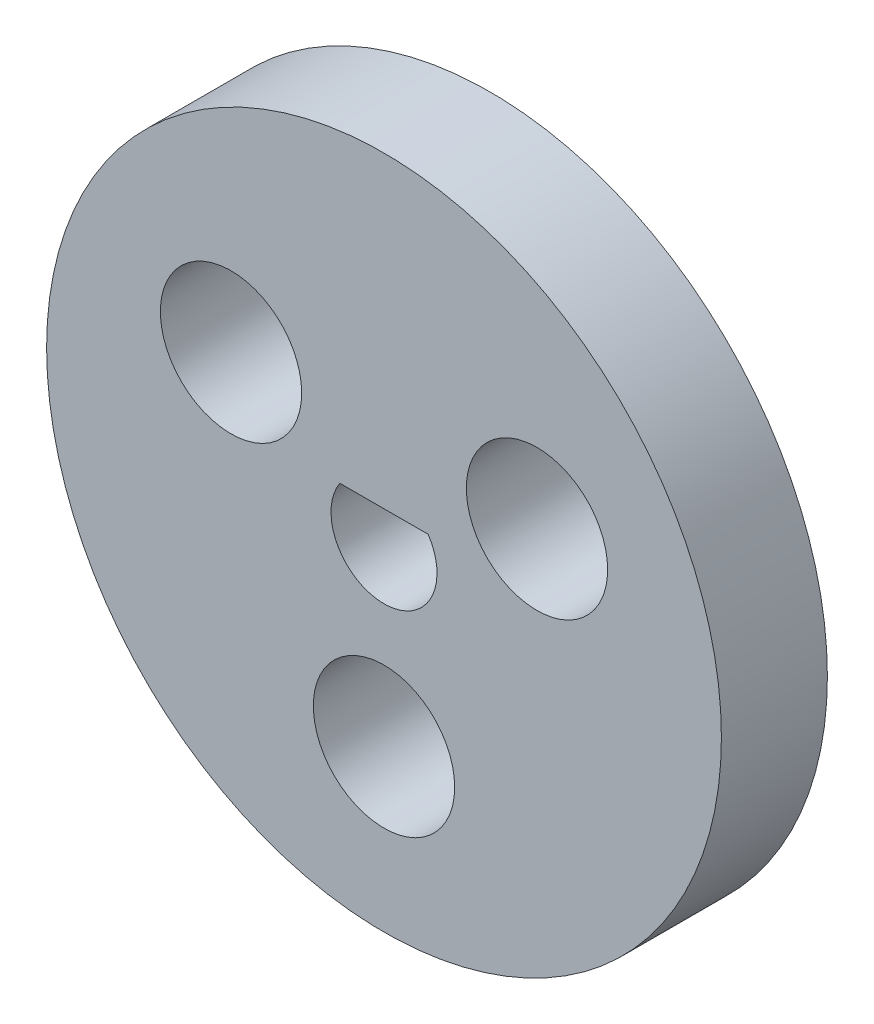
ISO-10303-21;
HEADER;
FILE_DESCRIPTION(('STEP AP214'),'2;1');
FILE_NAME('part.step','',(''),(''),'','','');
FILE_SCHEMA(('AUTOMOTIVE_DESIGN { 1 0 10303 214 1 1 1 1 }'));
ENDSEC;
DATA;
#1=APPLICATION_CONTEXT('core data for automotive mechanical design processes');
#2=APPLICATION_PROTOCOL_DEFINITION('international standard','automotive_design',2000,#1);
#3=PRODUCT_CONTEXT('',#1,'mechanical');
#4=PRODUCT('Part','Part','',(#3));
#5=PRODUCT_RELATED_PRODUCT_CATEGORY('part','',(#4));
#6=PRODUCT_DEFINITION_FORMATION('','',#4);
#7=PRODUCT_DEFINITION_CONTEXT('part definition',#1,'design');
#8=PRODUCT_DEFINITION('design','',#6,#7);
#9=PRODUCT_DEFINITION_SHAPE('','',#8);
#10=(LENGTH_UNIT() NAMED_UNIT(*) SI_UNIT(.MILLI.,.METRE.));
#11=(NAMED_UNIT(*) PLANE_ANGLE_UNIT() SI_UNIT($,.RADIAN.));
#12=(NAMED_UNIT(*) SI_UNIT($,.STERADIAN.) SOLID_ANGLE_UNIT());
#13=UNCERTAINTY_MEASURE_WITH_UNIT(LENGTH_MEASURE(1.E-05),#10,'distance_accuracy_value','');
#14=(GEOMETRIC_REPRESENTATION_CONTEXT(3) GLOBAL_UNCERTAINTY_ASSIGNED_CONTEXT((#13)) GLOBAL_UNIT_ASSIGNED_CONTEXT((#10,
#11,#12)) REPRESENTATION_CONTEXT('',''));
#15=CARTESIAN_POINT('',(0.,0.,0.));
#16=DIRECTION('',(0.,0.,1.));
#17=DIRECTION('',(1.,0.,0.));
#18=AXIS2_PLACEMENT_3D('',#15,#16,#17);
#19=CARTESIAN_POINT('',(0.,0.,3.));
#20=DIRECTION('',(0.,0.,-1.));
#21=DIRECTION('',(-1.,0.,0.));
#22=AXIS2_PLACEMENT_3D('',#19,#20,#21);
#23=CYLINDRICAL_SURFACE('',#22,1.5);
#24=CARTESIAN_POINT('',(0.,0.,0.));
#25=DIRECTION('',(0.,0.,1.));
#26=DIRECTION('',(1.,0.,0.));
#27=AXIS2_PLACEMENT_3D('',#24,#25,#26);
#28=CIRCLE('',#27,1.5);
#29=CARTESIAN_POINT('',(-1.25,0.82915619758885,0.));
#30=VERTEX_POINT('',#29);
#31=CARTESIAN_POINT('',(1.25,0.82915619758885,0.));
#32=VERTEX_POINT('',#31);
#33=EDGE_CURVE('E64',#30,#32,#28,.T.);
#34=ORIENTED_EDGE('',*,*,#33,.F.);
#35=DIRECTION('',(0.,0.,-1.));
#36=VECTOR('',#35,1.);
#37=CARTESIAN_POINT('',(-1.25,0.82915619758885,3.));
#38=LINE('',#37,#36);
#39=CARTESIAN_POINT('',(-1.25,0.82915619758885,3.));
#40=VERTEX_POINT('',#39);
#41=EDGE_CURVE('E11',#40,#30,#38,.T.);
#42=ORIENTED_EDGE('',*,*,#41,.F.);
#43=CARTESIAN_POINT('',(0.,0.,3.));
#44=DIRECTION('',(0.,0.,1.));
#45=DIRECTION('',(1.,0.,0.));
#46=AXIS2_PLACEMENT_3D('',#43,#44,#45);
#47=CIRCLE('',#46,1.5);
#48=CARTESIAN_POINT('',(1.25,0.82915619758885,3.));
#49=VERTEX_POINT('',#48);
#50=EDGE_CURVE('E67',#40,#49,#47,.T.);
#51=ORIENTED_EDGE('',*,*,#50,.T.);
#52=DIRECTION('',(0.,0.,-1.));
#53=VECTOR('',#52,1.);
#54=CARTESIAN_POINT('',(1.25,0.82915619758885,3.));
#55=LINE('',#54,#53);
#56=EDGE_CURVE('E49',#49,#32,#55,.T.);
#57=ORIENTED_EDGE('',*,*,#56,.T.);
#58=EDGE_LOOP('',(#34,#42,#51,#57));
#59=FACE_BOUND('',#58,.T.);
#60=ADVANCED_FACE('F39',(#59),#23,.F.);
#61=CARTESIAN_POINT('',(0.,-5.,3.));
#62=DIRECTION('',(0.,0.,-1.));
#63=DIRECTION('',(-1.,0.,0.));
#64=AXIS2_PLACEMENT_3D('',#61,#62,#63);
#65=CYLINDRICAL_SURFACE('',#64,2.00000000000001);
#66=CARTESIAN_POINT('',(0.,-5.,3.));
#67=DIRECTION('',(0.,0.,1.));
#68=DIRECTION('',(1.,0.,0.));
#69=AXIS2_PLACEMENT_3D('',#66,#67,#68);
#70=CIRCLE('',#69,2.00000000000001);
#71=CARTESIAN_POINT('',(2.00000000000001,-5.,3.));
#72=VERTEX_POINT('',#71);
#73=EDGE_CURVE('E112',#72,#72,#70,.T.);
#74=ORIENTED_EDGE('',*,*,#73,.T.);
#75=EDGE_LOOP('',(#74));
#76=FACE_BOUND('',#75,.T.);
#77=CARTESIAN_POINT('',(0.,-5.,0.));
#78=DIRECTION('',(0.,0.,1.));
#79=DIRECTION('',(1.,0.,0.));
#80=AXIS2_PLACEMENT_3D('',#77,#78,#79);
#81=CIRCLE('',#80,2.00000000000001);
#82=CARTESIAN_POINT('',(2.00000000000001,-5.,0.));
#83=VERTEX_POINT('',#82);
#84=EDGE_CURVE('E84',#83,#83,#81,.T.);
#85=ORIENTED_EDGE('',*,*,#84,.F.);
#86=EDGE_LOOP('',(#85));
#87=FACE_BOUND('',#86,.T.);
#88=ADVANCED_FACE('F135',(#76,#87),#65,.F.);
#89=CARTESIAN_POINT('',(4.3301270189222,2.49999999999999,3.));
#90=DIRECTION('',(0.,0.,-1.));
#91=DIRECTION('',(-1.,0.,0.));
#92=AXIS2_PLACEMENT_3D('',#89,#90,#91);
#93=CYLINDRICAL_SURFACE('',#92,1.99999999999999);
#94=CARTESIAN_POINT('',(4.3301270189222,2.49999999999999,3.));
#95=DIRECTION('',(0.,0.,1.));
#96=DIRECTION('',(1.,0.,0.));
#97=AXIS2_PLACEMENT_3D('',#94,#95,#96);
#98=CIRCLE('',#97,1.99999999999999);
#99=CARTESIAN_POINT('',(6.33012701892219,2.49999999999999,3.));
#100=VERTEX_POINT('',#99);
#101=EDGE_CURVE('E108',#100,#100,#98,.T.);
#102=ORIENTED_EDGE('',*,*,#101,.T.);
#103=EDGE_LOOP('',(#102));
#104=FACE_BOUND('',#103,.T.);
#105=CARTESIAN_POINT('',(4.3301270189222,2.49999999999999,0.));
#106=DIRECTION('',(0.,0.,1.));
#107=DIRECTION('',(1.,0.,0.));
#108=AXIS2_PLACEMENT_3D('',#105,#106,#107);
#109=CIRCLE('',#108,1.99999999999999);
#110=CARTESIAN_POINT('',(6.33012701892219,2.49999999999999,0.));
#111=VERTEX_POINT('',#110);
#112=EDGE_CURVE('E80',#111,#111,#109,.T.);
#113=ORIENTED_EDGE('',*,*,#112,.F.);
#114=EDGE_LOOP('',(#113));
#115=FACE_BOUND('',#114,.T.);
#116=ADVANCED_FACE('F132',(#104,#115),#93,.F.);
#117=CARTESIAN_POINT('',(0.,0.82915619758885,3.));
#118=DIRECTION('',(0.,-1.,0.));
#119=DIRECTION('',(0.,0.,-1.));
#120=AXIS2_PLACEMENT_3D('',#117,#118,#119);
#121=PLANE('',#120);
#122=DIRECTION('',(-1.,0.,0.));
#123=VECTOR('',#122,1.);
#124=CARTESIAN_POINT('',(0.,0.82915619758885,0.));
#125=LINE('',#124,#123);
#126=EDGE_CURVE('E74',#32,#30,#125,.T.);
#127=ORIENTED_EDGE('',*,*,#126,.F.);
#128=ORIENTED_EDGE('',*,*,#56,.F.);
#129=DIRECTION('',(-1.,0.,0.));
#130=VECTOR('',#129,1.);
#131=CARTESIAN_POINT('',(0.,0.82915619758885,3.));
#132=LINE('',#131,#130);
#133=EDGE_CURVE('E103',#49,#40,#132,.T.);
#134=ORIENTED_EDGE('',*,*,#133,.T.);
#135=ORIENTED_EDGE('',*,*,#41,.T.);
#136=EDGE_LOOP('',(#127,#128,#134,#135));
#137=FACE_BOUND('',#136,.T.);
#138=ADVANCED_FACE('F78',(#137),#121,.T.);
#139=CARTESIAN_POINT('',(-4.3301270189222,2.49999999999999,3.));
#140=DIRECTION('',(0.,0.,-1.));
#141=DIRECTION('',(-1.,0.,0.));
#142=AXIS2_PLACEMENT_3D('',#139,#140,#141);
#143=CYLINDRICAL_SURFACE('',#142,2.00000000000004);
#144=CARTESIAN_POINT('',(-4.3301270189222,2.49999999999999,3.));
#145=DIRECTION('',(0.,0.,1.));
#146=DIRECTION('',(1.,0.,0.));
#147=AXIS2_PLACEMENT_3D('',#144,#145,#146);
#148=CIRCLE('',#147,2.00000000000004);
#149=CARTESIAN_POINT('',(-2.33012701892216,2.49999999999999,3.));
#150=VERTEX_POINT('',#149);
#151=EDGE_CURVE('E94',#150,#150,#148,.T.);
#152=ORIENTED_EDGE('',*,*,#151,.T.);
#153=EDGE_LOOP('',(#152));
#154=FACE_BOUND('',#153,.T.);
#155=CARTESIAN_POINT('',(-4.3301270189222,2.49999999999999,0.));
#156=DIRECTION('',(0.,0.,1.));
#157=DIRECTION('',(1.,0.,0.));
#158=AXIS2_PLACEMENT_3D('',#155,#156,#157);
#159=CIRCLE('',#158,2.00000000000004);
#160=CARTESIAN_POINT('',(-2.33012701892216,2.49999999999999,0.));
#161=VERTEX_POINT('',#160);
#162=EDGE_CURVE('E76',#161,#161,#159,.T.);
#163=ORIENTED_EDGE('',*,*,#162,.F.);
#164=EDGE_LOOP('',(#163));
#165=FACE_BOUND('',#164,.T.);
#166=ADVANCED_FACE('F41',(#154,#165),#143,.F.);
#167=CARTESIAN_POINT('',(0.,0.,3.));
#168=DIRECTION('',(0.,0.,-1.));
#169=DIRECTION('',(-1.,0.,0.));
#170=AXIS2_PLACEMENT_3D('',#167,#168,#169);
#171=CYLINDRICAL_SURFACE('',#170,9.55000000000002);
#172=CARTESIAN_POINT('',(0.,0.,3.));
#173=DIRECTION('',(0.,0.,1.));
#174=DIRECTION('',(1.,0.,0.));
#175=AXIS2_PLACEMENT_3D('',#172,#173,#174);
#176=CIRCLE('',#175,9.55000000000002);
#177=CARTESIAN_POINT('',(9.55000000000002,0.,3.));
#178=VERTEX_POINT('',#177);
#179=EDGE_CURVE('E70',#178,#178,#176,.T.);
#180=ORIENTED_EDGE('',*,*,#179,.F.);
#181=EDGE_LOOP('',(#180));
#182=FACE_BOUND('',#181,.T.);
#183=CARTESIAN_POINT('',(0.,0.,0.));
#184=DIRECTION('',(0.,0.,1.));
#185=DIRECTION('',(1.,0.,0.));
#186=AXIS2_PLACEMENT_3D('',#183,#184,#185);
#187=CIRCLE('',#186,9.55000000000002);
#188=CARTESIAN_POINT('',(9.55000000000002,0.,0.));
#189=VERTEX_POINT('',#188);
#190=EDGE_CURVE('E91',#189,#189,#187,.T.);
#191=ORIENTED_EDGE('',*,*,#190,.T.);
#192=EDGE_LOOP('',(#191));
#193=FACE_BOUND('',#192,.T.);
#194=ADVANCED_FACE('F124',(#182,#193),#171,.T.);
#195=CARTESIAN_POINT('',(0.,0.,3.));
#196=DIRECTION('',(0.,0.,1.));
#197=DIRECTION('',(1.,0.,0.));
#198=AXIS2_PLACEMENT_3D('',#195,#196,#197);
#199=PLANE('',#198);
#200=ORIENTED_EDGE('',*,*,#151,.F.);
#201=EDGE_LOOP('',(#200));
#202=FACE_BOUND('',#201,.T.);
#203=ORIENTED_EDGE('',*,*,#50,.F.);
#204=ORIENTED_EDGE('',*,*,#133,.F.);
#205=EDGE_LOOP('',(#203,#204));
#206=FACE_BOUND('',#205,.T.);
#207=ORIENTED_EDGE('',*,*,#101,.F.);
#208=EDGE_LOOP('',(#207));
#209=FACE_BOUND('',#208,.T.);
#210=ORIENTED_EDGE('',*,*,#73,.F.);
#211=EDGE_LOOP('',(#210));
#212=FACE_BOUND('',#211,.T.);
#213=ORIENTED_EDGE('',*,*,#179,.T.);
#214=EDGE_LOOP('',(#213));
#215=FACE_BOUND('',#214,.T.);
#216=ADVANCED_FACE('F129',(#202,#206,#209,#212,#215),#199,.T.);
#217=CARTESIAN_POINT('',(0.,0.,0.));
#218=DIRECTION('',(0.,0.,1.));
#219=DIRECTION('',(1.,0.,0.));
#220=AXIS2_PLACEMENT_3D('',#217,#218,#219);
#221=PLANE('',#220);
#222=ORIENTED_EDGE('',*,*,#162,.T.);
#223=EDGE_LOOP('',(#222));
#224=FACE_BOUND('',#223,.T.);
#225=ORIENTED_EDGE('',*,*,#33,.T.);
#226=ORIENTED_EDGE('',*,*,#126,.T.);
#227=EDGE_LOOP('',(#225,#226));
#228=FACE_BOUND('',#227,.T.);
#229=ORIENTED_EDGE('',*,*,#112,.T.);
#230=EDGE_LOOP('',(#229));
#231=FACE_BOUND('',#230,.T.);
#232=ORIENTED_EDGE('',*,*,#84,.T.);
#233=EDGE_LOOP('',(#232));
#234=FACE_BOUND('',#233,.T.);
#235=ORIENTED_EDGE('',*,*,#190,.F.);
#236=EDGE_LOOP('',(#235));
#237=FACE_BOUND('',#236,.T.);
#238=ADVANCED_FACE('F72',(#224,#228,#231,#234,#237),#221,.F.);
#239=CLOSED_SHELL('',(#60,#88,#116,#138,#166,#194,#216,#238));
#240=MANIFOLD_SOLID_BREP('B2',#239);
#241=ADVANCED_BREP_SHAPE_REPRESENTATION('',(#18,#240),#14);
#242=SHAPE_DEFINITION_REPRESENTATION(#9,#241);
ENDSEC;
END-ISO-10303-21;
